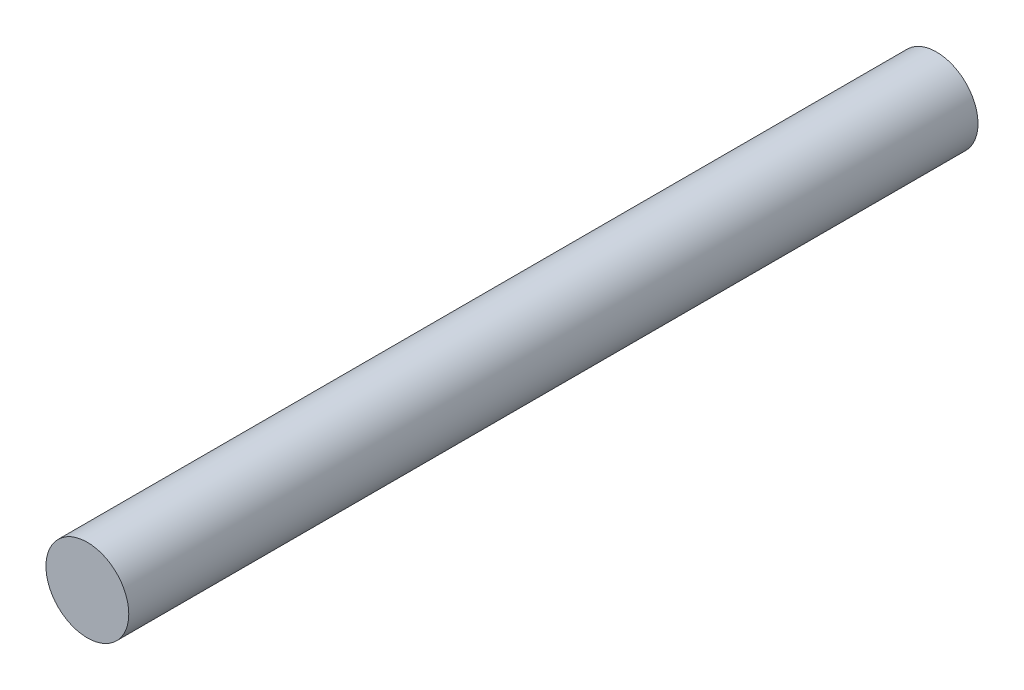
ISO-10303-21;
HEADER;
FILE_DESCRIPTION(('STEP AP214'),'2;1');
FILE_NAME('part.step','',(''),(''),'','','');
FILE_SCHEMA(('AUTOMOTIVE_DESIGN { 1 0 10303 214 1 1 1 1 }'));
ENDSEC;
DATA;
#1=APPLICATION_CONTEXT('core data for automotive mechanical design processes');
#2=APPLICATION_PROTOCOL_DEFINITION('international standard','automotive_design',2000,#1);
#3=PRODUCT_CONTEXT('',#1,'mechanical');
#4=PRODUCT('Part','Part','',(#3));
#5=PRODUCT_RELATED_PRODUCT_CATEGORY('part','',(#4));
#6=PRODUCT_DEFINITION_FORMATION('','',#4);
#7=PRODUCT_DEFINITION_CONTEXT('part definition',#1,'design');
#8=PRODUCT_DEFINITION('design','',#6,#7);
#9=PRODUCT_DEFINITION_SHAPE('','',#8);
#10=(LENGTH_UNIT() NAMED_UNIT(*) SI_UNIT(.MILLI.,.METRE.));
#11=(NAMED_UNIT(*) PLANE_ANGLE_UNIT() SI_UNIT($,.RADIAN.));
#12=(NAMED_UNIT(*) SI_UNIT($,.STERADIAN.) SOLID_ANGLE_UNIT());
#13=UNCERTAINTY_MEASURE_WITH_UNIT(LENGTH_MEASURE(1.E-05),#10,'distance_accuracy_value','');
#14=(GEOMETRIC_REPRESENTATION_CONTEXT(3) GLOBAL_UNCERTAINTY_ASSIGNED_CONTEXT((#13)) GLOBAL_UNIT_ASSIGNED_CONTEXT((#10,
#11,#12)) REPRESENTATION_CONTEXT('',''));
#15=CARTESIAN_POINT('',(0.,0.,0.));
#16=DIRECTION('',(0.,0.,1.));
#17=DIRECTION('',(1.,0.,0.));
#18=AXIS2_PLACEMENT_3D('',#15,#16,#17);
#19=CARTESIAN_POINT('',(0.,0.,82.));
#20=DIRECTION('',(0.,0.,-1.));
#21=DIRECTION('',(-1.,0.,0.));
#22=AXIS2_PLACEMENT_3D('',#19,#20,#21);
#23=CYLINDRICAL_SURFACE('',#22,4.);
#24=CARTESIAN_POINT('',(0.,0.,82.));
#25=DIRECTION('',(0.,0.,1.));
#26=DIRECTION('',(1.,0.,0.));
#27=AXIS2_PLACEMENT_3D('',#24,#25,#26);
#28=CIRCLE('',#27,4.);
#29=CARTESIAN_POINT('',(4.,0.,82.));
#30=VERTEX_POINT('',#29);
#31=EDGE_CURVE('E10',#30,#30,#28,.T.);
#32=ORIENTED_EDGE('',*,*,#31,.F.);
#33=EDGE_LOOP('',(#32));
#34=FACE_BOUND('',#33,.T.);
#35=CARTESIAN_POINT('',(0.,0.,0.));
#36=DIRECTION('',(0.,0.,1.));
#37=DIRECTION('',(1.,0.,0.));
#38=AXIS2_PLACEMENT_3D('',#35,#36,#37);
#39=CIRCLE('',#38,4.);
#40=CARTESIAN_POINT('',(4.,0.,0.));
#41=VERTEX_POINT('',#40);
#42=EDGE_CURVE('E37',#41,#41,#39,.T.);
#43=ORIENTED_EDGE('',*,*,#42,.T.);
#44=EDGE_LOOP('',(#43));
#45=FACE_BOUND('',#44,.T.);
#46=ADVANCED_FACE('F34',(#34,#45),#23,.T.);
#47=CARTESIAN_POINT('',(0.,0.,82.));
#48=DIRECTION('',(0.,0.,1.));
#49=DIRECTION('',(1.,0.,0.));
#50=AXIS2_PLACEMENT_3D('',#47,#48,#49);
#51=PLANE('',#50);
#52=ORIENTED_EDGE('',*,*,#31,.T.);
#53=EDGE_LOOP('',(#52));
#54=FACE_BOUND('',#53,.T.);
#55=ADVANCED_FACE('F49',(#54),#51,.T.);
#56=CARTESIAN_POINT('',(0.,0.,0.));
#57=DIRECTION('',(0.,0.,1.));
#58=DIRECTION('',(1.,0.,0.));
#59=AXIS2_PLACEMENT_3D('',#56,#57,#58);
#60=PLANE('',#59);
#61=ORIENTED_EDGE('',*,*,#42,.F.);
#62=EDGE_LOOP('',(#61));
#63=FACE_BOUND('',#62,.T.);
#64=ADVANCED_FACE('F47',(#63),#60,.F.);
#65=CLOSED_SHELL('',(#46,#55,#64));
#66=MANIFOLD_SOLID_BREP('B2',#65);
#67=ADVANCED_BREP_SHAPE_REPRESENTATION('',(#18,#66),#14);
#68=SHAPE_DEFINITION_REPRESENTATION(#9,#67);
ENDSEC;
END-ISO-10303-21;
